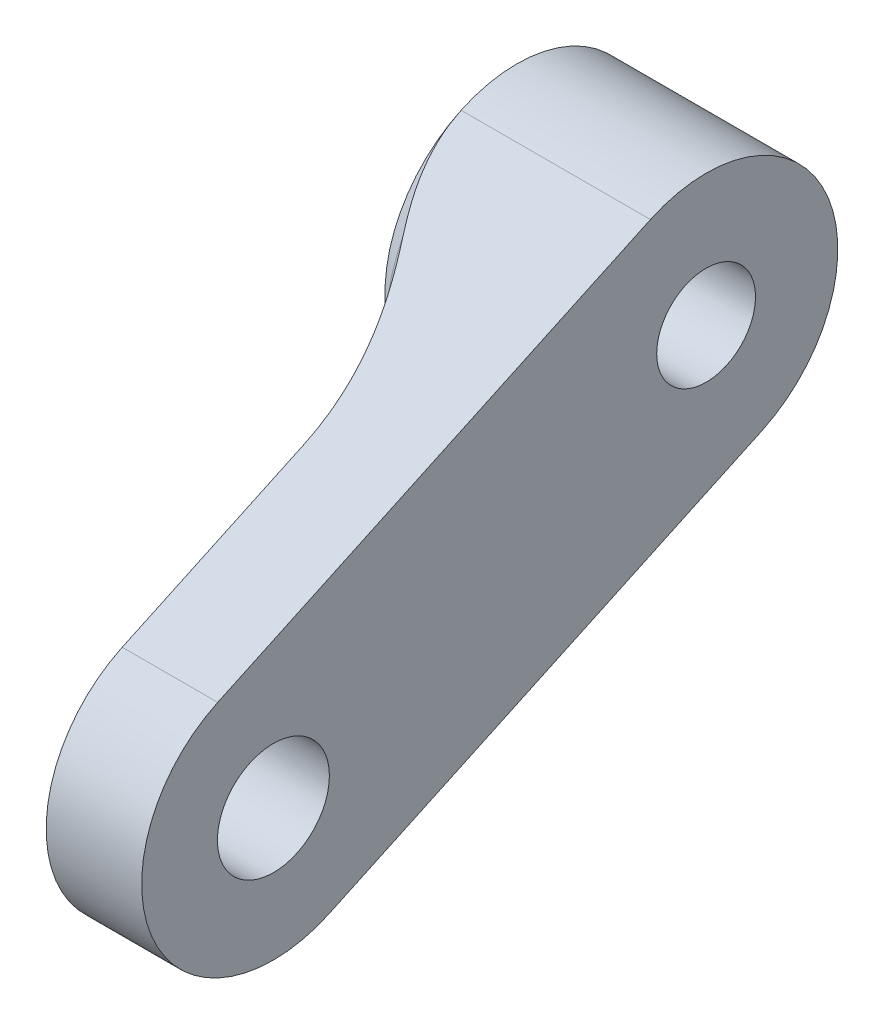
ISO-10303-21;
HEADER;
FILE_DESCRIPTION(('STEP AP214'),'2;1');
FILE_NAME('part.step','',(''),(''),'','','');
FILE_SCHEMA(('AUTOMOTIVE_DESIGN { 1 0 10303 214 1 1 1 1 }'));
ENDSEC;
DATA;
#1=APPLICATION_CONTEXT('core data for automotive mechanical design processes');
#2=APPLICATION_PROTOCOL_DEFINITION('international standard','automotive_design',2000,#1);
#3=PRODUCT_CONTEXT('',#1,'mechanical');
#4=PRODUCT('Part','Part','',(#3));
#5=PRODUCT_RELATED_PRODUCT_CATEGORY('part','',(#4));
#6=PRODUCT_DEFINITION_FORMATION('','',#4);
#7=PRODUCT_DEFINITION_CONTEXT('part definition',#1,'design');
#8=PRODUCT_DEFINITION('design','',#6,#7);
#9=PRODUCT_DEFINITION_SHAPE('','',#8);
#10=(LENGTH_UNIT() NAMED_UNIT(*) SI_UNIT(.MILLI.,.METRE.));
#11=(NAMED_UNIT(*) PLANE_ANGLE_UNIT() SI_UNIT($,.RADIAN.));
#12=(NAMED_UNIT(*) SI_UNIT($,.STERADIAN.) SOLID_ANGLE_UNIT());
#13=UNCERTAINTY_MEASURE_WITH_UNIT(LENGTH_MEASURE(1.E-05),#10,'distance_accuracy_value','');
#14=(GEOMETRIC_REPRESENTATION_CONTEXT(3) GLOBAL_UNCERTAINTY_ASSIGNED_CONTEXT((#13)) GLOBAL_UNIT_ASSIGNED_CONTEXT((#10,
#11,#12)) REPRESENTATION_CONTEXT('',''));
#15=CARTESIAN_POINT('',(0.,0.,0.));
#16=DIRECTION('',(0.,0.,1.));
#17=DIRECTION('',(1.,0.,0.));
#18=AXIS2_PLACEMENT_3D('',#15,#16,#17);
#19=CARTESIAN_POINT('',(46.902,-26.9452969109237,-39.4773715725835));
#20=DIRECTION('',(0.,-0.906307787036651,-0.422618261740698));
#21=DIRECTION('',(0.,0.422618261740698,-0.906307787036651));
#22=AXIS2_PLACEMENT_3D('',#19,#20,#21);
#23=PLANE('',#22);
#24=DIRECTION('',(-1.,0.,0.));
#25=VECTOR('',#24,1.);
#26=CARTESIAN_POINT('',(46.902,-23.8813145133037,-46.0481030285993));
#27=LINE('',#26,#25);
#28=CARTESIAN_POINT('',(46.9,-23.8813145133037,-46.0481030285993));
#29=VERTEX_POINT('',#28);
#30=CARTESIAN_POINT('',(41.15,-23.8813145133037,-46.0481030285993));
#31=VERTEX_POINT('',#30);
#32=EDGE_CURVE('E117',#29,#31,#27,.T.);
#33=ORIENTED_EDGE('',*,*,#32,.F.);
#34=DIRECTION('',(0.,0.422618261740692,-0.906307787036653));
#35=VECTOR('',#34,1.);
#36=CARTESIAN_POINT('',(46.9,-23.8813145133037,-46.0481030285993));
#37=LINE('',#36,#35);
#38=CARTESIAN_POINT('',(46.9,-30.0092793085437,-32.9066401165679));
#39=VERTEX_POINT('',#38);
#40=EDGE_CURVE('E131',#39,#29,#37,.T.);
#41=ORIENTED_EDGE('',*,*,#40,.F.);
#42=DIRECTION('',(-1.,0.,0.));
#43=VECTOR('',#42,1.);
#44=CARTESIAN_POINT('',(46.9,-30.0092793085437,-32.9066401165679));
#45=LINE('',#44,#43);
#46=CARTESIAN_POINT('',(44.,-30.0092793085437,-32.9066401165679));
#47=VERTEX_POINT('',#46);
#48=EDGE_CURVE('E143',#39,#47,#45,.T.);
#49=ORIENTED_EDGE('',*,*,#48,.T.);
#50=DIRECTION('',(0.,0.422618261740692,-0.906307787036653));
#51=VECTOR('',#50,1.);
#52=CARTESIAN_POINT('',(44.,-23.8813145133037,-46.0481030285993));
#53=LINE('',#52,#51);
#54=CARTESIAN_POINT('',(44.,-27.4460557943261,-38.4034906816206));
#55=VERTEX_POINT('',#54);
#56=EDGE_CURVE('E132',#47,#55,#53,.T.);
#57=ORIENTED_EDGE('',*,*,#56,.T.);
#58=CARTESIAN_POINT('',(44.,-27.4460557943261,-38.4034906816206));
#59=CARTESIAN_POINT('',(44.0000277007138,-27.3618138556501,-38.5841481021082));
#60=CARTESIAN_POINT('',(43.9918932068011,-27.277598823287,-38.7647478218219));
#61=CARTESIAN_POINT('',(43.9601510076592,-27.1097430641156,-39.1247156590122));
#62=CARTESIAN_POINT('',(43.9365535257737,-27.0261019947261,-39.3040845111569));
#63=CARTESIAN_POINT('',(43.8752739038295,-26.861253631031,-39.6576029679358));
#64=CARTESIAN_POINT('',(43.8378448195937,-26.780029339297,-39.8317890236728));
#65=CARTESIAN_POINT('',(43.7498304356229,-26.6188597569904,-40.1774183083048));
#66=CARTESIAN_POINT('',(43.6992428218886,-26.5389146940047,-40.3488610491382));
#67=CARTESIAN_POINT('',(43.564628535929,-26.3507468655689,-40.7523882594362));
#68=CARTESIAN_POINT('',(43.4751836034767,-26.2432143038676,-40.9829925821848));
#69=CARTESIAN_POINT('',(43.2763731462326,-26.0314027697071,-41.4372238830357));
#70=CARTESIAN_POINT('',(43.1669874549556,-25.9271272173247,-41.6608435267597));
#71=CARTESIAN_POINT('',(42.9892107174685,-25.771963576402,-41.9935930285299));
#72=CARTESIAN_POINT('',(42.9268212393555,-25.7198236773036,-42.1054074029811));
#73=CARTESIAN_POINT('',(42.7982796586262,-25.6163719253851,-42.3272604009092));
#74=CARTESIAN_POINT('',(42.7321272404917,-25.565060142466,-42.4372988744828));
#75=CARTESIAN_POINT('',(42.5968095537605,-25.4633284819693,-42.655463124453));
#76=CARTESIAN_POINT('',(42.5276524181795,-25.4129066599109,-42.7635930708019));
#77=CARTESIAN_POINT('',(42.3868510318471,-25.3127067696734,-42.9784724288504));
#78=CARTESIAN_POINT('',(42.3152075506957,-25.2629285087261,-43.0852222539429));
#79=CARTESIAN_POINT('',(42.2426406871193,-25.2133995759922,-43.1914373929561));
#80=B_SPLINE_CURVE_WITH_KNOTS('',3,(#58,#59,#60,#61,#62,#63,#64,#65,#66,#67,#68,#69,#70,#71,#72,
#73,#74,#75,#76,#77,#78,#79),.UNSPECIFIED.,.F.,.F.,(4,2,2,2,2,2,2,2,2,2,4),(0.,
0.597740368998135,1.19508594056136,1.78200410376661,2.36902554960082,3.17714083560146,
3.98607796480843,4.40077822352791,4.81551330579327,5.22918832677155,5.6427364251054),.UNSPECIFIED.);
#81=CARTESIAN_POINT('',(42.2426406871191,-25.2133995759923,-43.1914373929561));
#82=VERTEX_POINT('',#81);
#83=EDGE_CURVE('E64',#55,#82,#80,.T.);
#84=ORIENTED_EDGE('',*,*,#83,.T.);
#85=CARTESIAN_POINT('',(42.2426406871192,-25.2133995759922,-43.1914373929562));
#86=CARTESIAN_POINT('',(41.7337676519531,-24.8659297998866,-43.9365887324826));
#87=CARTESIAN_POINT('',(41.4738065002324,-24.5755562646394,-44.559296788353));
#88=CARTESIAN_POINT('',(41.15,-24.2138682293843,-45.3349392830231));
#89=CARTESIAN_POINT('',(41.15,-23.8813145133036,-46.0481030285992));
#90=B_SPLINE_CURVE_WITH_KNOTS('',2,(#85,#86,#87,#88,#89),.UNSPECIFIED.,.F.,.F.,(3,2,3),(0.,0.5,
1.),.UNSPECIFIED.);
#91=EDGE_CURVE('E154',#82,#31,#90,.T.);
#92=ORIENTED_EDGE('',*,*,#91,.T.);
#93=EDGE_LOOP('',(#33,#41,#49,#57,#84,#92));
#94=FACE_BOUND('',#93,.T.);
#95=ADVANCED_FACE('F49',(#94),#23,.T.);
#96=CARTESIAN_POINT('',(46.902,-19.6948346146305,-36.096425478658));
#97=DIRECTION('',(0.,-0.90630778703665,-0.422618261740699));
#98=DIRECTION('',(0.,0.422618261740699,-0.90630778703665));
#99=AXIS2_PLACEMENT_3D('',#96,#97,#98);
#100=PLANE('',#99);
#101=CARTESIAN_POINT('',(41.15,-16.6308522170104,-42.6671569346737));
#102=CARTESIAN_POINT('',(41.15,-16.9643856466347,-41.9518921866232));
#103=CARTESIAN_POINT('',(41.4752016035928,-17.32699423941,-41.1742755499803));
#104=CARTESIAN_POINT('',(41.7341496921036,-17.615728369068,-40.5550832107414));
#105=CARTESIAN_POINT('',(42.2426406871248,-17.9629372797028,-39.8104912990225));
#106=B_SPLINE_CURVE_WITH_KNOTS('',2,(#101,#102,#103,#104,#105),.UNSPECIFIED.,.F.,.F.,(3,2,3),
(0.,0.5,1.),.UNSPECIFIED.);
#107=CARTESIAN_POINT('',(41.15,-16.6308522170105,-42.6671569346737));
#108=VERTEX_POINT('',#107);
#109=CARTESIAN_POINT('',(42.2426406871246,-17.9629372797028,-39.8104912990224));
#110=VERTEX_POINT('',#109);
#111=EDGE_CURVE('E203',#108,#110,#106,.T.);
#112=ORIENTED_EDGE('',*,*,#111,.T.);
#113=CARTESIAN_POINT('',(42.2426406871193,-17.9629372797053,-39.8104912990274));
#114=CARTESIAN_POINT('',(42.2914424080192,-17.9962561981149,-39.7390386479077));
#115=CARTESIAN_POINT('',(42.3398349301294,-18.029682594217,-39.6673555101363));
#116=CARTESIAN_POINT('',(42.4355918918371,-18.096800914174,-39.5234198084934));
#117=CARTESIAN_POINT('',(42.4829562453964,-18.1304928599312,-39.4511671976523));
#118=CARTESIAN_POINT('',(42.623251008266,-18.2320857098459,-39.2333006279371));
#119=CARTESIAN_POINT('',(42.7143086862438,-18.3004533949855,-39.0866856540155));
#120=CARTESIAN_POINT('',(42.8905348470274,-18.4391222597864,-38.7893093137904));
#121=CARTESIAN_POINT('',(42.9756603954368,-18.5094332368279,-38.6385269369372));
#122=CARTESIAN_POINT('',(43.1380226255361,-18.6516483108895,-38.3335457264115));
#123=CARTESIAN_POINT('',(43.2152615373403,-18.7235519505127,-38.1793478736296));
#124=CARTESIAN_POINT('',(43.3580769875655,-18.8663731042951,-37.873066920948));
#125=CARTESIAN_POINT('',(43.4239725745522,-18.9372334078057,-37.7211065096802));
#126=CARTESIAN_POINT('',(43.5463622522698,-19.0803878419311,-37.4141108349967));
#127=CARTESIAN_POINT('',(43.602857404474,-19.152681809627,-37.2590759209616));
#128=CARTESIAN_POINT('',(43.7054027147298,-19.2983630234416,-36.9466615497481));
#129=CARTESIAN_POINT('',(43.7514819359214,-19.3717466030745,-36.7892899553735));
#130=CARTESIAN_POINT('',(43.8325616428087,-19.519582079507,-36.4722557530671));
#131=CARTESIAN_POINT('',(43.8675662056901,-19.5940335725725,-36.3125940109461));
#132=CARTESIAN_POINT('',(43.9134959562903,-19.7121686605928,-36.0592524971314));
#133=CARTESIAN_POINT('',(43.9283501194831,-19.755584924149,-35.9661460194724));
#134=CARTESIAN_POINT('',(43.9539880926183,-19.8426372147766,-35.7794617797755));
#135=CARTESIAN_POINT('',(43.9647715778431,-19.8862732590985,-35.6858839807433));
#136=CARTESIAN_POINT('',(43.9822354970224,-19.9741496880915,-35.4974323706183));
#137=CARTESIAN_POINT('',(43.9888720531747,-20.0183916354395,-35.4025552083536));
#138=CARTESIAN_POINT('',(43.9977553398005,-20.1069528525718,-35.2126350653247));
#139=CARTESIAN_POINT('',(44.0000021716658,-20.1512721205464,-35.1175920884411));
#140=CARTESIAN_POINT('',(44.,-20.1955934980329,-35.0225445876949));
#141=B_SPLINE_CURVE_WITH_KNOTS('',3,(#113,#114,#115,#116,#117,#118,#119,#120,#121,#122,#123,
#124,#125,#126,#127,#128,#129,#130,#131,#132,#133,#134,#135,#136,#137,#138,#139,#140),
.UNSPECIFIED.,.F.,.F.,(4,2,2,2,2,2,2,2,2,2,2,2,2,4),(0.,0.278162737702117,0.556348663286709,
1.11314108256535,1.67361612233131,2.23393223437475,2.77414072420821,3.31428817360463,
3.85290933848224,4.39133197615709,4.70266180074753,5.01401645485726,5.32861205570111,
5.64320039008572),.UNSPECIFIED.);
#142=CARTESIAN_POINT('',(44.,-20.1955934980329,-35.022544587695));
#143=VERTEX_POINT('',#142);
#144=EDGE_CURVE('E12',#110,#143,#141,.T.);
#145=ORIENTED_EDGE('',*,*,#144,.T.);
#146=DIRECTION('',(0.,-0.422618261740703,0.906307787036648));
#147=VECTOR('',#146,1.);
#148=CARTESIAN_POINT('',(44.,-22.7588170122506,-29.5256940226423));
#149=LINE('',#148,#147);
#150=CARTESIAN_POINT('',(44.,-22.7588170122506,-29.5256940226423));
#151=VERTEX_POINT('',#150);
#152=EDGE_CURVE('E144',#143,#151,#149,.T.);
#153=ORIENTED_EDGE('',*,*,#152,.T.);
#154=DIRECTION('',(-1.,0.,0.));
#155=VECTOR('',#154,1.);
#156=CARTESIAN_POINT('',(46.9,-22.7588170122506,-29.5256940226423));
#157=LINE('',#156,#155);
#158=CARTESIAN_POINT('',(46.9,-22.7588170122506,-29.5256940226423));
#159=VERTEX_POINT('',#158);
#160=EDGE_CURVE('E123',#159,#151,#157,.T.);
#161=ORIENTED_EDGE('',*,*,#160,.F.);
#162=DIRECTION('',(0.,-0.422618261740703,0.906307787036648));
#163=VECTOR('',#162,1.);
#164=CARTESIAN_POINT('',(46.9,-22.7588170122506,-29.5256940226423));
#165=LINE('',#164,#163);
#166=CARTESIAN_POINT('',(46.9,-16.6308522170104,-42.6671569346737));
#167=VERTEX_POINT('',#166);
#168=EDGE_CURVE('E120',#167,#159,#165,.T.);
#169=ORIENTED_EDGE('',*,*,#168,.F.);
#170=DIRECTION('',(-1.,0.,0.));
#171=VECTOR('',#170,1.);
#172=CARTESIAN_POINT('',(46.902,-16.6308522170104,-42.6671569346737));
#173=LINE('',#172,#171);
#174=EDGE_CURVE('E108',#167,#108,#173,.T.);
#175=ORIENTED_EDGE('',*,*,#174,.T.);
#176=EDGE_LOOP('',(#112,#145,#153,#161,#169,#175));
#177=FACE_BOUND('',#176,.T.);
#178=ADVANCED_FACE('F121',(#177),#100,.F.);
#179=CARTESIAN_POINT('',(46.902,-20.256083365157,-44.3576299816365));
#180=DIRECTION('',(-1.,0.,0.));
#181=DIRECTION('',(0.,0.,1.));
#182=AXIS2_PLACEMENT_3D('',#179,#180,#181);
#183=CYLINDRICAL_SURFACE('',#182,4.);
#184=ORIENTED_EDGE('',*,*,#174,.F.);
#185=CARTESIAN_POINT('',(46.9,-20.256083365157,-44.3576299816365));
#186=DIRECTION('',(1.,0.,0.));
#187=DIRECTION('',(0.,0.,1.));
#188=AXIS2_PLACEMENT_3D('',#185,#186,#187);
#189=CIRCLE('',#188,4.00000000000004);
#190=EDGE_CURVE('E112',#29,#167,#189,.T.);
#191=ORIENTED_EDGE('',*,*,#190,.F.);
#192=ORIENTED_EDGE('',*,*,#32,.T.);
#193=CARTESIAN_POINT('',(41.15,-20.256083365157,-44.3576299816365));
#194=DIRECTION('',(-1.,0.,0.));
#195=DIRECTION('',(0.,0.,1.));
#196=AXIS2_PLACEMENT_3D('',#193,#194,#195);
#197=CIRCLE('',#196,4.);
#198=EDGE_CURVE('E114',#108,#31,#197,.T.);
#199=ORIENTED_EDGE('',*,*,#198,.F.);
#200=EDGE_LOOP('',(#184,#191,#192,#199));
#201=FACE_BOUND('',#200,.T.);
#202=ADVANCED_FACE('F110',(#201),#183,.T.);
#203=CARTESIAN_POINT('',(41.15,-20.256083365157,-44.3576299816365));
#204=DIRECTION('',(1.,0.,0.));
#205=DIRECTION('',(0.,0.,-1.));
#206=AXIS2_PLACEMENT_3D('',#203,#204,#205);
#207=CONICAL_SURFACE('',#206,4.,0.785398163397449);
#208=ORIENTED_EDGE('',*,*,#91,.F.);
#209=CARTESIAN_POINT('',(42.2426406871193,-20.256083365157,-44.3576299816365));
#210=DIRECTION('',(1.,0.,0.));
#211=DIRECTION('',(0.,0.,-1.));
#212=AXIS2_PLACEMENT_3D('',#209,#210,#211);
#213=CIRCLE('',#212,5.09264068711929);
#214=EDGE_CURVE('E183',#82,#110,#213,.F.);
#215=ORIENTED_EDGE('',*,*,#214,.T.);
#216=ORIENTED_EDGE('',*,*,#111,.F.);
#217=CARTESIAN_POINT('',(41.15,-20.256083365157,-44.3576299816365));
#218=DIRECTION('',(-1.,0.,0.));
#219=DIRECTION('',(0.,0.,1.));
#220=AXIS2_PLACEMENT_3D('',#217,#218,#219);
#221=CIRCLE('',#220,4.);
#222=EDGE_CURVE('E195',#31,#108,#221,.T.);
#223=ORIENTED_EDGE('',*,*,#222,.F.);
#224=EDGE_LOOP('',(#208,#215,#216,#223));
#225=FACE_BOUND('',#224,.T.);
#226=ADVANCED_FACE('F306',(#225),#207,.T.);
#227=CARTESIAN_POINT('',(41.15,-19.1273702103221,-37.9563795870577));
#228=DIRECTION('',(-1.,0.,0.));
#229=DIRECTION('',(0.,0.,1.));
#230=AXIS2_PLACEMENT_3D('',#227,#228,#229);
#231=PLANE('',#230);
#232=CARTESIAN_POINT('',(41.15,-20.256083365157,-44.3576299816365));
#233=DIRECTION('',(-1.,0.,0.));
#234=DIRECTION('',(0.,0.,1.));
#235=AXIS2_PLACEMENT_3D('',#232,#233,#234);
#236=CIRCLE('',#235,2.70000000000001);
#237=CARTESIAN_POINT('',(41.15,-20.256083365157,-41.6576299816365));
#238=VERTEX_POINT('',#237);
#239=EDGE_CURVE('E189',#238,#238,#236,.F.);
#240=ORIENTED_EDGE('',*,*,#239,.T.);
#241=EDGE_LOOP('',(#240));
#242=FACE_BOUND('',#241,.T.);
#243=ORIENTED_EDGE('',*,*,#198,.T.);
#244=ORIENTED_EDGE('',*,*,#222,.T.);
#245=EDGE_LOOP('',(#243,#244));
#246=FACE_BOUND('',#245,.T.);
#247=ADVANCED_FACE('F172',(#242,#246),#231,.T.);
#248=CARTESIAN_POINT('',(46.9,-26.3840481603972,-31.2161670696051));
#249=DIRECTION('',(-1.,0.,0.));
#250=DIRECTION('',(0.,0.,1.));
#251=AXIS2_PLACEMENT_3D('',#248,#249,#250);
#252=CYLINDRICAL_SURFACE('',#251,3.99999999999996);
#253=CARTESIAN_POINT('',(44.,-26.3840481603972,-31.2161670696051));
#254=DIRECTION('',(1.,0.,0.));
#255=DIRECTION('',(0.,0.,1.));
#256=AXIS2_PLACEMENT_3D('',#253,#254,#255);
#257=CIRCLE('',#256,3.99999999999996);
#258=EDGE_CURVE('E135',#151,#47,#257,.T.);
#259=ORIENTED_EDGE('',*,*,#258,.T.);
#260=ORIENTED_EDGE('',*,*,#48,.F.);
#261=CARTESIAN_POINT('',(46.9,-26.3840481603972,-31.2161670696051));
#262=DIRECTION('',(1.,0.,0.));
#263=DIRECTION('',(0.,0.,1.));
#264=AXIS2_PLACEMENT_3D('',#261,#262,#263);
#265=CIRCLE('',#264,3.99999999999996);
#266=EDGE_CURVE('E126',#159,#39,#265,.T.);
#267=ORIENTED_EDGE('',*,*,#266,.F.);
#268=ORIENTED_EDGE('',*,*,#160,.T.);
#269=EDGE_LOOP('',(#259,#260,#267,#268));
#270=FACE_BOUND('',#269,.T.);
#271=ADVANCED_FACE('F368',(#270),#252,.T.);
#272=CARTESIAN_POINT('',(46.9,-20.256083365157,-44.3576299816365));
#273=DIRECTION('',(-1.,0.,0.));
#274=DIRECTION('',(0.,0.,1.));
#275=AXIS2_PLACEMENT_3D('',#272,#273,#274);
#276=PLANE('',#275);
#277=CARTESIAN_POINT('',(46.9,-20.256083365157,-44.3576299816365));
#278=DIRECTION('',(-1.,0.,0.));
#279=DIRECTION('',(0.,0.,1.));
#280=AXIS2_PLACEMENT_3D('',#277,#278,#279);
#281=CIRCLE('',#280,1.50000000000002);
#282=CARTESIAN_POINT('',(46.9,-20.256083365157,-42.8576299816365));
#283=VERTEX_POINT('',#282);
#284=EDGE_CURVE('E196',#283,#283,#281,.T.);
#285=ORIENTED_EDGE('',*,*,#284,.T.);
#286=EDGE_LOOP('',(#285));
#287=FACE_BOUND('',#286,.T.);
#288=CARTESIAN_POINT('',(46.9,-26.3840481603972,-31.2161670696051));
#289=DIRECTION('',(1.,0.,0.));
#290=DIRECTION('',(0.,0.,-1.));
#291=AXIS2_PLACEMENT_3D('',#288,#289,#290);
#292=CIRCLE('',#291,1.70000000000001);
#293=CARTESIAN_POINT('',(46.9,-26.3840481603972,-32.9161670696051));
#294=VERTEX_POINT('',#293);
#295=EDGE_CURVE('E199',#294,#294,#292,.T.);
#296=ORIENTED_EDGE('',*,*,#295,.F.);
#297=EDGE_LOOP('',(#296));
#298=FACE_BOUND('',#297,.T.);
#299=ORIENTED_EDGE('',*,*,#190,.T.);
#300=ORIENTED_EDGE('',*,*,#168,.T.);
#301=ORIENTED_EDGE('',*,*,#266,.T.);
#302=ORIENTED_EDGE('',*,*,#40,.T.);
#303=EDGE_LOOP('',(#299,#300,#301,#302));
#304=FACE_BOUND('',#303,.T.);
#305=ADVANCED_FACE('F129',(#287,#298,#304),#276,.F.);
#306=CARTESIAN_POINT('',(44.,-20.256083365157,-44.3576299816365));
#307=DIRECTION('',(-1.,0.,0.));
#308=DIRECTION('',(0.,0.,1.));
#309=AXIS2_PLACEMENT_3D('',#306,#307,#308);
#310=PLANE('',#309);
#311=CARTESIAN_POINT('',(44.,-26.3840481603972,-31.2161670696051));
#312=DIRECTION('',(-1.,0.,0.));
#313=DIRECTION('',(0.,0.,1.));
#314=AXIS2_PLACEMENT_3D('',#311,#312,#313);
#315=CIRCLE('',#314,1.70000000000001);
#316=CARTESIAN_POINT('',(44.,-26.3840481603972,-29.5161670696051));
#317=VERTEX_POINT('',#316);
#318=EDGE_CURVE('E138',#317,#317,#315,.T.);
#319=ORIENTED_EDGE('',*,*,#318,.F.);
#320=EDGE_LOOP('',(#319));
#321=FACE_BOUND('',#320,.T.);
#322=ORIENTED_EDGE('',*,*,#152,.F.);
#323=CARTESIAN_POINT('',(44.,-20.256083365157,-44.3576299816365));
#324=DIRECTION('',(-1.,0.,0.));
#325=DIRECTION('',(0.,0.,1.));
#326=AXIS2_PLACEMENT_3D('',#323,#324,#325);
#327=CIRCLE('',#326,9.33528137423857);
#328=EDGE_CURVE('E187',#143,#55,#327,.F.);
#329=ORIENTED_EDGE('',*,*,#328,.T.);
#330=ORIENTED_EDGE('',*,*,#56,.F.);
#331=ORIENTED_EDGE('',*,*,#258,.F.);
#332=EDGE_LOOP('',(#322,#329,#330,#331));
#333=FACE_BOUND('',#332,.T.);
#334=ADVANCED_FACE('F415',(#321,#333),#310,.T.);
#335=CARTESIAN_POINT('',(46.9,-26.3840481603972,-31.2161670696051));
#336=DIRECTION('',(1.,0.,0.));
#337=DIRECTION('',(0.,0.,-1.));
#338=AXIS2_PLACEMENT_3D('',#335,#336,#337);
#339=CYLINDRICAL_SURFACE('',#338,1.70000000000001);
#340=ORIENTED_EDGE('',*,*,#318,.T.);
#341=EDGE_LOOP('',(#340));
#342=FACE_BOUND('',#341,.T.);
#343=ORIENTED_EDGE('',*,*,#295,.T.);
#344=EDGE_LOOP('',(#343));
#345=FACE_BOUND('',#344,.T.);
#346=ADVANCED_FACE('F426',(#342,#345),#339,.F.);
#347=CARTESIAN_POINT('',(41.15,-20.256083365157,-44.3576299816365));
#348=DIRECTION('',(-1.,0.,0.));
#349=DIRECTION('',(0.,0.,1.));
#350=AXIS2_PLACEMENT_3D('',#347,#348,#349);
#351=CYLINDRICAL_SURFACE('',#350,1.50000000000002);
#352=CARTESIAN_POINT('',(43.95,-20.256083365157,-44.3576299816365));
#353=DIRECTION('',(-1.,0.,0.));
#354=DIRECTION('',(0.,0.,1.));
#355=AXIS2_PLACEMENT_3D('',#352,#353,#354);
#356=CIRCLE('',#355,1.50000000000002);
#357=CARTESIAN_POINT('',(43.95,-20.256083365157,-42.8576299816365));
#358=VERTEX_POINT('',#357);
#359=EDGE_CURVE('E200',#358,#358,#356,.T.);
#360=ORIENTED_EDGE('',*,*,#359,.T.);
#361=EDGE_LOOP('',(#360));
#362=FACE_BOUND('',#361,.T.);
#363=ORIENTED_EDGE('',*,*,#284,.F.);
#364=EDGE_LOOP('',(#363));
#365=FACE_BOUND('',#364,.T.);
#366=ADVANCED_FACE('F437',(#362,#365),#351,.F.);
#367=CARTESIAN_POINT('',(43.95,-18.756083365157,-44.3576299816365));
#368=DIRECTION('',(1.,0.,0.));
#369=DIRECTION('',(0.,0.,-1.));
#370=AXIS2_PLACEMENT_3D('',#367,#368,#369);
#371=PLANE('',#370);
#372=ORIENTED_EDGE('',*,*,#359,.F.);
#373=EDGE_LOOP('',(#372));
#374=FACE_BOUND('',#373,.T.);
#375=CARTESIAN_POINT('',(43.95,-20.256083365157,-44.3576299816365));
#376=DIRECTION('',(-1.,0.,0.));
#377=DIRECTION('',(0.,0.,1.));
#378=AXIS2_PLACEMENT_3D('',#375,#376,#377);
#379=CIRCLE('',#378,2.20000000000001);
#380=CARTESIAN_POINT('',(43.95,-20.256083365157,-42.1576299816365));
#381=VERTEX_POINT('',#380);
#382=EDGE_CURVE('E514',#381,#381,#379,.T.);
#383=ORIENTED_EDGE('',*,*,#382,.T.);
#384=EDGE_LOOP('',(#383));
#385=FACE_BOUND('',#384,.T.);
#386=ADVANCED_FACE('F447',(#374,#385),#371,.F.);
#387=CARTESIAN_POINT('',(41.15,-20.256083365157,-44.3576299816365));
#388=DIRECTION('',(-1.,0.,0.));
#389=DIRECTION('',(0.,0.,1.));
#390=AXIS2_PLACEMENT_3D('',#387,#388,#389);
#391=CYLINDRICAL_SURFACE('',#390,2.20000000000001);
#392=CARTESIAN_POINT('',(41.65,-20.256083365157,-44.3576299816365));
#393=DIRECTION('',(-1.,0.,0.));
#394=DIRECTION('',(0.,0.,1.));
#395=AXIS2_PLACEMENT_3D('',#392,#393,#394);
#396=CIRCLE('',#395,2.20000000000001);
#397=CARTESIAN_POINT('',(41.65,-20.256083365157,-42.1576299816365));
#398=VERTEX_POINT('',#397);
#399=EDGE_CURVE('E192',#398,#398,#396,.T.);
#400=ORIENTED_EDGE('',*,*,#399,.T.);
#401=EDGE_LOOP('',(#400));
#402=FACE_BOUND('',#401,.T.);
#403=ORIENTED_EDGE('',*,*,#382,.F.);
#404=EDGE_LOOP('',(#403));
#405=FACE_BOUND('',#404,.T.);
#406=ADVANCED_FACE('F458',(#402,#405),#391,.F.);
#407=CARTESIAN_POINT('',(41.65,-20.256083365157,-44.3576299816365));
#408=DIRECTION('',(-1.,0.,0.));
#409=DIRECTION('',(0.,0.,1.));
#410=AXIS2_PLACEMENT_3D('',#407,#408,#409);
#411=CONICAL_SURFACE('',#410,2.20000000000001,0.785398163397455);
#412=ORIENTED_EDGE('',*,*,#239,.F.);
#413=EDGE_LOOP('',(#412));
#414=FACE_BOUND('',#413,.T.);
#415=ORIENTED_EDGE('',*,*,#399,.F.);
#416=EDGE_LOOP('',(#415));
#417=FACE_BOUND('',#416,.T.);
#418=ADVANCED_FACE('F315',(#414,#417),#411,.F.);
#419=CARTESIAN_POINT('',(38.,-20.256083365157,-44.3576299816365));
#420=DIRECTION('',(-1.,0.,0.));
#421=DIRECTION('',(0.,0.,1.));
#422=AXIS2_PLACEMENT_3D('',#419,#420,#421);
#423=TOROIDAL_SURFACE('',#422,9.33528137423857,6.);
#424=ORIENTED_EDGE('',*,*,#144,.F.);
#425=ORIENTED_EDGE('',*,*,#214,.F.);
#426=ORIENTED_EDGE('',*,*,#83,.F.);
#427=ORIENTED_EDGE('',*,*,#328,.F.);
#428=EDGE_LOOP('',(#424,#425,#426,#427));
#429=FACE_BOUND('',#428,.T.);
#430=ADVANCED_FACE('F51',(#429),#423,.F.);
#431=CLOSED_SHELL('',(#95,#178,#202,#226,#247,#271,#305,#334,#346,#366,#386,#406,#418,#430));
#432=MANIFOLD_SOLID_BREP('B2',#431);
#433=ADVANCED_BREP_SHAPE_REPRESENTATION('',(#18,#432),#14);
#434=SHAPE_DEFINITION_REPRESENTATION(#9,#433);
ENDSEC;
END-ISO-10303-21;
